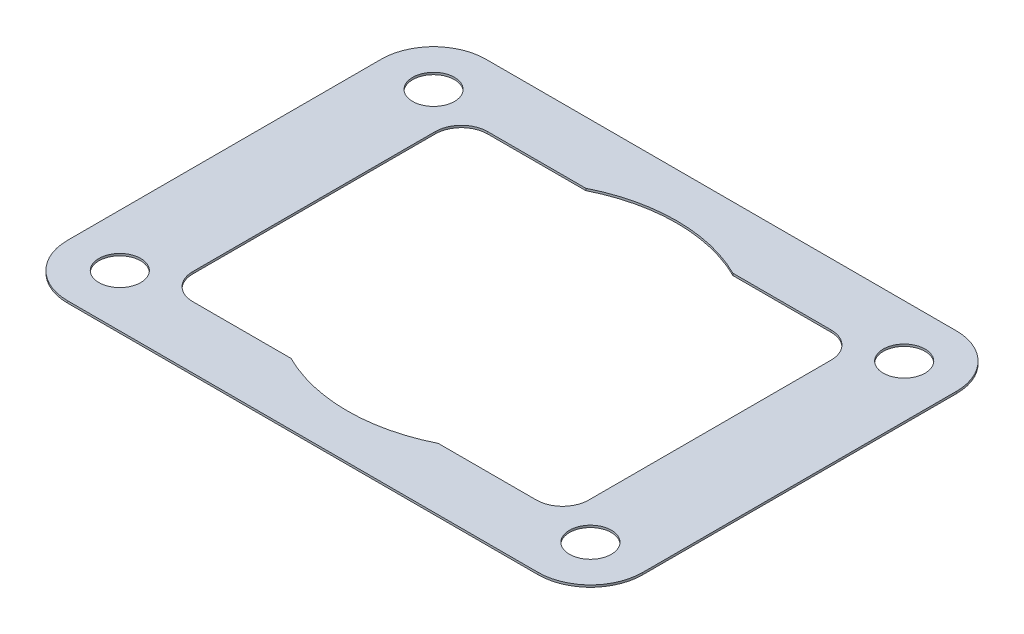
ISO-10303-21;
HEADER;
FILE_DESCRIPTION(('STEP AP214'),'2;1');
FILE_NAME('part.step','',(''),(''),'','','');
FILE_SCHEMA(('AUTOMOTIVE_DESIGN { 1 0 10303 214 1 1 1 1 }'));
ENDSEC;
DATA;
#1=APPLICATION_CONTEXT('core data for automotive mechanical design processes');
#2=APPLICATION_PROTOCOL_DEFINITION('international standard','automotive_design',2000,#1);
#3=PRODUCT_CONTEXT('',#1,'mechanical');
#4=PRODUCT('Part','Part','',(#3));
#5=PRODUCT_RELATED_PRODUCT_CATEGORY('part','',(#4));
#6=PRODUCT_DEFINITION_FORMATION('','',#4);
#7=PRODUCT_DEFINITION_CONTEXT('part definition',#1,'design');
#8=PRODUCT_DEFINITION('design','',#6,#7);
#9=PRODUCT_DEFINITION_SHAPE('','',#8);
#10=(LENGTH_UNIT() NAMED_UNIT(*) SI_UNIT(.MILLI.,.METRE.));
#11=(NAMED_UNIT(*) PLANE_ANGLE_UNIT() SI_UNIT($,.RADIAN.));
#12=(NAMED_UNIT(*) SI_UNIT($,.STERADIAN.) SOLID_ANGLE_UNIT());
#13=UNCERTAINTY_MEASURE_WITH_UNIT(LENGTH_MEASURE(1.E-05),#10,'distance_accuracy_value','');
#14=(GEOMETRIC_REPRESENTATION_CONTEXT(3) GLOBAL_UNCERTAINTY_ASSIGNED_CONTEXT((#13)) GLOBAL_UNIT_ASSIGNED_CONTEXT((#10,
#11,#12)) REPRESENTATION_CONTEXT('',''));
#15=CARTESIAN_POINT('',(0.,0.,0.));
#16=DIRECTION('',(0.,0.,1.));
#17=DIRECTION('',(1.,0.,0.));
#18=AXIS2_PLACEMENT_3D('',#15,#16,#17);
#19=CARTESIAN_POINT('',(48.0695,0.,-35.7886));
#20=DIRECTION('',(0.,0.,-1.));
#21=DIRECTION('',(-1.,0.,0.));
#22=AXIS2_PLACEMENT_3D('',#19,#20,#21);
#23=PLANE('',#22);
#24=DIRECTION('',(-1.,0.,0.));
#25=VECTOR('',#24,1.);
#26=CARTESIAN_POINT('',(48.0695,0.,-35.7886));
#27=LINE('',#26,#25);
#28=CARTESIAN_POINT('',(-17.8766925084032,0.,-35.7886));
#29=VERTEX_POINT('',#28);
#30=CARTESIAN_POINT('',(-41.7195,0.,-35.7886));
#31=VERTEX_POINT('',#30);
#32=EDGE_CURVE('E321',#29,#31,#27,.T.);
#33=ORIENTED_EDGE('',*,*,#32,.F.);
#34=DIRECTION('',(0.,1.,0.));
#35=VECTOR('',#34,1.);
#36=CARTESIAN_POINT('',(-17.8766925084032,0.,-35.7886));
#37=LINE('',#36,#35);
#38=CARTESIAN_POINT('',(-17.8766925084032,0.508,-35.7886));
#39=VERTEX_POINT('',#38);
#40=EDGE_CURVE('E378',#29,#39,#37,.T.);
#41=ORIENTED_EDGE('',*,*,#40,.T.);
#42=DIRECTION('',(-1.,0.,0.));
#43=VECTOR('',#42,1.);
#44=CARTESIAN_POINT('',(48.0695,0.508,-35.7886));
#45=LINE('',#44,#43);
#46=CARTESIAN_POINT('',(-41.7195,0.508,-35.7886));
#47=VERTEX_POINT('',#46);
#48=EDGE_CURVE('E204',#39,#47,#45,.T.);
#49=ORIENTED_EDGE('',*,*,#48,.T.);
#50=DIRECTION('',(0.,1.,0.));
#51=VECTOR('',#50,1.);
#52=CARTESIAN_POINT('',(-41.7195,0.,-35.7886));
#53=LINE('',#52,#51);
#54=EDGE_CURVE('E285',#47,#31,#53,.F.);
#55=ORIENTED_EDGE('',*,*,#54,.T.);
#56=EDGE_LOOP('',(#33,#41,#49,#55));
#57=FACE_BOUND('',#56,.T.);
#58=ADVANCED_FACE('F37',(#57),#23,.F.);
#59=CARTESIAN_POINT('',(48.0695,0.,35.7886));
#60=DIRECTION('',(0.,0.,1.));
#61=DIRECTION('',(1.,0.,0.));
#62=AXIS2_PLACEMENT_3D('',#59,#60,#61);
#63=PLANE('',#62);
#64=DIRECTION('',(1.,0.,0.));
#65=VECTOR('',#64,1.);
#66=CARTESIAN_POINT('',(48.0695,0.,35.7886));
#67=LINE('',#66,#65);
#68=CARTESIAN_POINT('',(17.8766925084032,0.,35.7886));
#69=VERTEX_POINT('',#68);
#70=CARTESIAN_POINT('',(41.7195,0.,35.7886));
#71=VERTEX_POINT('',#70);
#72=EDGE_CURVE('E186',#69,#71,#67,.T.);
#73=ORIENTED_EDGE('',*,*,#72,.F.);
#74=DIRECTION('',(0.,1.,0.));
#75=VECTOR('',#74,1.);
#76=CARTESIAN_POINT('',(17.8766925084032,0.,35.7886));
#77=LINE('',#76,#75);
#78=CARTESIAN_POINT('',(17.8766925084032,0.508,35.7886));
#79=VERTEX_POINT('',#78);
#80=EDGE_CURVE('E11',#69,#79,#77,.T.);
#81=ORIENTED_EDGE('',*,*,#80,.T.);
#82=DIRECTION('',(1.,0.,0.));
#83=VECTOR('',#82,1.);
#84=CARTESIAN_POINT('',(48.0695,0.508,35.7886));
#85=LINE('',#84,#83);
#86=CARTESIAN_POINT('',(41.7195,0.508,35.7886));
#87=VERTEX_POINT('',#86);
#88=EDGE_CURVE('E184',#79,#87,#85,.T.);
#89=ORIENTED_EDGE('',*,*,#88,.T.);
#90=DIRECTION('',(0.,1.,0.));
#91=VECTOR('',#90,1.);
#92=CARTESIAN_POINT('',(41.7195,0.,35.7886));
#93=LINE('',#92,#91);
#94=EDGE_CURVE('E278',#87,#71,#93,.F.);
#95=ORIENTED_EDGE('',*,*,#94,.T.);
#96=EDGE_LOOP('',(#73,#81,#89,#95));
#97=FACE_BOUND('',#96,.T.);
#98=ADVANCED_FACE('F182',(#97),#63,.F.);
#99=CARTESIAN_POINT('',(-69.85,0.508,50.8));
#100=DIRECTION('',(1.,0.,0.));
#101=DIRECTION('',(0.,0.,-1.));
#102=AXIS2_PLACEMENT_3D('',#99,#100,#101);
#103=PLANE('',#102);
#104=DIRECTION('',(0.,0.,1.));
#105=VECTOR('',#104,1.);
#106=CARTESIAN_POINT('',(-69.85,0.508,50.8));
#107=LINE('',#106,#105);
#108=CARTESIAN_POINT('',(-69.85,0.508,-38.1));
#109=VERTEX_POINT('',#108);
#110=CARTESIAN_POINT('',(-69.85,0.508,38.1));
#111=VERTEX_POINT('',#110);
#112=EDGE_CURVE('E209',#109,#111,#107,.T.);
#113=ORIENTED_EDGE('',*,*,#112,.F.);
#114=DIRECTION('',(0.,-1.,0.));
#115=VECTOR('',#114,1.);
#116=CARTESIAN_POINT('',(-69.85,0.508,-38.1));
#117=LINE('',#116,#115);
#118=CARTESIAN_POINT('',(-69.85,0.,-38.1));
#119=VERTEX_POINT('',#118);
#120=EDGE_CURVE('E236',#109,#119,#117,.T.);
#121=ORIENTED_EDGE('',*,*,#120,.T.);
#122=DIRECTION('',(0.,0.,1.));
#123=VECTOR('',#122,1.);
#124=CARTESIAN_POINT('',(-69.85,0.,50.8));
#125=LINE('',#124,#123);
#126=CARTESIAN_POINT('',(-69.85,0.,38.1));
#127=VERTEX_POINT('',#126);
#128=EDGE_CURVE('E223',#119,#127,#125,.T.);
#129=ORIENTED_EDGE('',*,*,#128,.T.);
#130=DIRECTION('',(0.,-1.,0.));
#131=VECTOR('',#130,1.);
#132=CARTESIAN_POINT('',(-69.85,0.508,38.1));
#133=LINE('',#132,#131);
#134=EDGE_CURVE('E222',#127,#111,#133,.F.);
#135=ORIENTED_EDGE('',*,*,#134,.T.);
#136=EDGE_LOOP('',(#113,#121,#129,#135));
#137=FACE_BOUND('',#136,.T.);
#138=ADVANCED_FACE('F358',(#137),#103,.F.);
#139=CARTESIAN_POINT('',(69.85,0.508,50.8));
#140=DIRECTION('',(0.,0.,-1.));
#141=DIRECTION('',(-1.,0.,0.));
#142=AXIS2_PLACEMENT_3D('',#139,#140,#141);
#143=PLANE('',#142);
#144=DIRECTION('',(1.,0.,0.));
#145=VECTOR('',#144,1.);
#146=CARTESIAN_POINT('',(69.85,0.,50.8));
#147=LINE('',#146,#145);
#148=CARTESIAN_POINT('',(-57.15,0.,50.8));
#149=VERTEX_POINT('',#148);
#150=CARTESIAN_POINT('',(57.15,0.,50.8));
#151=VERTEX_POINT('',#150);
#152=EDGE_CURVE('E226',#149,#151,#147,.T.);
#153=ORIENTED_EDGE('',*,*,#152,.T.);
#154=DIRECTION('',(0.,-1.,0.));
#155=VECTOR('',#154,1.);
#156=CARTESIAN_POINT('',(57.15,0.508,50.8));
#157=LINE('',#156,#155);
#158=CARTESIAN_POINT('',(57.15,0.508,50.8));
#159=VERTEX_POINT('',#158);
#160=EDGE_CURVE('E268',#151,#159,#157,.F.);
#161=ORIENTED_EDGE('',*,*,#160,.T.);
#162=DIRECTION('',(1.,0.,0.));
#163=VECTOR('',#162,1.);
#164=CARTESIAN_POINT('',(69.85,0.508,50.8));
#165=LINE('',#164,#163);
#166=CARTESIAN_POINT('',(-57.15,0.508,50.8));
#167=VERTEX_POINT('',#166);
#168=EDGE_CURVE('E212',#167,#159,#165,.T.);
#169=ORIENTED_EDGE('',*,*,#168,.F.);
#170=DIRECTION('',(0.,-1.,0.));
#171=VECTOR('',#170,1.);
#172=CARTESIAN_POINT('',(-57.15,0.508,50.8));
#173=LINE('',#172,#171);
#174=EDGE_CURVE('E265',#167,#149,#173,.T.);
#175=ORIENTED_EDGE('',*,*,#174,.T.);
#176=EDGE_LOOP('',(#153,#161,#169,#175));
#177=FACE_BOUND('',#176,.T.);
#178=ADVANCED_FACE('F429',(#177),#143,.F.);
#179=CARTESIAN_POINT('',(69.85,0.508,50.8));
#180=DIRECTION('',(-1.,0.,0.));
#181=DIRECTION('',(0.,0.,1.));
#182=AXIS2_PLACEMENT_3D('',#179,#180,#181);
#183=PLANE('',#182);
#184=DIRECTION('',(0.,0.,-1.));
#185=VECTOR('',#184,1.);
#186=CARTESIAN_POINT('',(69.85,0.,50.8));
#187=LINE('',#186,#185);
#188=CARTESIAN_POINT('',(69.85,0.,38.1));
#189=VERTEX_POINT('',#188);
#190=CARTESIAN_POINT('',(69.85,0.,-38.1));
#191=VERTEX_POINT('',#190);
#192=EDGE_CURVE('E230',#189,#191,#187,.T.);
#193=ORIENTED_EDGE('',*,*,#192,.T.);
#194=DIRECTION('',(0.,-1.,0.));
#195=VECTOR('',#194,1.);
#196=CARTESIAN_POINT('',(69.85,0.508,-38.1));
#197=LINE('',#196,#195);
#198=CARTESIAN_POINT('',(69.85,0.508,-38.1));
#199=VERTEX_POINT('',#198);
#200=EDGE_CURVE('E263',#191,#199,#197,.F.);
#201=ORIENTED_EDGE('',*,*,#200,.T.);
#202=DIRECTION('',(0.,0.,-1.));
#203=VECTOR('',#202,1.);
#204=CARTESIAN_POINT('',(69.85,0.508,50.8));
#205=LINE('',#204,#203);
#206=CARTESIAN_POINT('',(69.85,0.508,38.1));
#207=VERTEX_POINT('',#206);
#208=EDGE_CURVE('E216',#207,#199,#205,.T.);
#209=ORIENTED_EDGE('',*,*,#208,.F.);
#210=DIRECTION('',(0.,-1.,0.));
#211=VECTOR('',#210,1.);
#212=CARTESIAN_POINT('',(69.85,0.508,38.1));
#213=LINE('',#212,#211);
#214=EDGE_CURVE('E260',#207,#189,#213,.T.);
#215=ORIENTED_EDGE('',*,*,#214,.T.);
#216=EDGE_LOOP('',(#193,#201,#209,#215));
#217=FACE_BOUND('',#216,.T.);
#218=ADVANCED_FACE('F438',(#217),#183,.F.);
#219=CARTESIAN_POINT('',(69.85,0.508,-50.8));
#220=DIRECTION('',(0.,0.,1.));
#221=DIRECTION('',(1.,0.,0.));
#222=AXIS2_PLACEMENT_3D('',#219,#220,#221);
#223=PLANE('',#222);
#224=DIRECTION('',(-1.,0.,0.));
#225=VECTOR('',#224,1.);
#226=CARTESIAN_POINT('',(69.85,0.,-50.8));
#227=LINE('',#226,#225);
#228=CARTESIAN_POINT('',(57.15,0.,-50.8));
#229=VERTEX_POINT('',#228);
#230=CARTESIAN_POINT('',(-57.15,0.,-50.8));
#231=VERTEX_POINT('',#230);
#232=EDGE_CURVE('E213',#229,#231,#227,.T.);
#233=ORIENTED_EDGE('',*,*,#232,.T.);
#234=DIRECTION('',(0.,-1.,0.));
#235=VECTOR('',#234,1.);
#236=CARTESIAN_POINT('',(-57.15,0.508,-50.8));
#237=LINE('',#236,#235);
#238=CARTESIAN_POINT('',(-57.15,0.508,-50.8));
#239=VERTEX_POINT('',#238);
#240=EDGE_CURVE('E250',#231,#239,#237,.F.);
#241=ORIENTED_EDGE('',*,*,#240,.T.);
#242=DIRECTION('',(-1.,0.,0.));
#243=VECTOR('',#242,1.);
#244=CARTESIAN_POINT('',(69.85,0.508,-50.8));
#245=LINE('',#244,#243);
#246=CARTESIAN_POINT('',(57.15,0.508,-50.8));
#247=VERTEX_POINT('',#246);
#248=EDGE_CURVE('E219',#247,#239,#245,.T.);
#249=ORIENTED_EDGE('',*,*,#248,.F.);
#250=DIRECTION('',(0.,-1.,0.));
#251=VECTOR('',#250,1.);
#252=CARTESIAN_POINT('',(57.15,0.508,-50.8));
#253=LINE('',#252,#251);
#254=EDGE_CURVE('E247',#247,#229,#253,.T.);
#255=ORIENTED_EDGE('',*,*,#254,.T.);
#256=EDGE_LOOP('',(#233,#241,#249,#255));
#257=FACE_BOUND('',#256,.T.);
#258=ADVANCED_FACE('F407',(#257),#223,.F.);
#259=CARTESIAN_POINT('',(0.,0.508,0.));
#260=DIRECTION('',(0.,1.,0.));
#261=DIRECTION('',(0.,0.,1.));
#262=AXIS2_PLACEMENT_3D('',#259,#260,#261);
#263=PLANE('',#262);
#264=CARTESIAN_POINT('',(0.,0.508,0.));
#265=DIRECTION('',(0.,1.,0.));
#266=DIRECTION('',(0.,0.,1.));
#267=AXIS2_PLACEMENT_3D('',#264,#265,#266);
#268=CIRCLE('',#267,40.005);
#269=CARTESIAN_POINT('',(17.8766925084032,0.508,-35.7886));
#270=VERTEX_POINT('',#269);
#271=EDGE_CURVE('E178',#270,#39,#268,.T.);
#272=ORIENTED_EDGE('',*,*,#271,.F.);
#273=CARTESIAN_POINT('',(41.7195,0.508,-35.7886));
#274=VERTEX_POINT('',#273);
#275=EDGE_CURVE('E205',#274,#270,#45,.T.);
#276=ORIENTED_EDGE('',*,*,#275,.F.);
#277=CARTESIAN_POINT('',(41.7195,0.508,-29.4386));
#278=DIRECTION('',(0.,1.,0.));
#279=DIRECTION('',(0.,0.,1.));
#280=AXIS2_PLACEMENT_3D('',#277,#278,#279);
#281=CIRCLE('',#280,6.35);
#282=CARTESIAN_POINT('',(48.0695,0.508,-29.4386));
#283=VERTEX_POINT('',#282);
#284=EDGE_CURVE('E298',#274,#283,#281,.F.);
#285=ORIENTED_EDGE('',*,*,#284,.T.);
#286=DIRECTION('',(0.,0.,-1.));
#287=VECTOR('',#286,1.);
#288=CARTESIAN_POINT('',(48.0695,0.508,35.7886));
#289=LINE('',#288,#287);
#290=CARTESIAN_POINT('',(48.0695,0.508,29.4386));
#291=VERTEX_POINT('',#290);
#292=EDGE_CURVE('E196',#291,#283,#289,.T.);
#293=ORIENTED_EDGE('',*,*,#292,.F.);
#294=CARTESIAN_POINT('',(41.7195,0.508,29.4386));
#295=DIRECTION('',(0.,1.,0.));
#296=DIRECTION('',(0.,0.,1.));
#297=AXIS2_PLACEMENT_3D('',#294,#295,#296);
#298=CIRCLE('',#297,6.35);
#299=EDGE_CURVE('E191',#291,#87,#298,.F.);
#300=ORIENTED_EDGE('',*,*,#299,.T.);
#301=ORIENTED_EDGE('',*,*,#88,.F.);
#302=CARTESIAN_POINT('',(-17.8766925084032,0.508,35.7886));
#303=VERTEX_POINT('',#302);
#304=EDGE_CURVE('E172',#303,#79,#268,.T.);
#305=ORIENTED_EDGE('',*,*,#304,.F.);
#306=CARTESIAN_POINT('',(-41.7195,0.508,35.7886));
#307=VERTEX_POINT('',#306);
#308=EDGE_CURVE('E193',#307,#303,#85,.T.);
#309=ORIENTED_EDGE('',*,*,#308,.F.);
#310=CARTESIAN_POINT('',(-41.7195,0.508,29.4386));
#311=DIRECTION('',(0.,1.,0.));
#312=DIRECTION('',(0.,0.,1.));
#313=AXIS2_PLACEMENT_3D('',#310,#311,#312);
#314=CIRCLE('',#313,6.35);
#315=CARTESIAN_POINT('',(-48.0695,0.508,29.4386));
#316=VERTEX_POINT('',#315);
#317=EDGE_CURVE('E294',#307,#316,#314,.F.);
#318=ORIENTED_EDGE('',*,*,#317,.T.);
#319=DIRECTION('',(0.,0.,1.));
#320=VECTOR('',#319,1.);
#321=CARTESIAN_POINT('',(-48.0695,0.508,35.7886));
#322=LINE('',#321,#320);
#323=CARTESIAN_POINT('',(-48.0695,0.508,-29.4386));
#324=VERTEX_POINT('',#323);
#325=EDGE_CURVE('E194',#324,#316,#322,.T.);
#326=ORIENTED_EDGE('',*,*,#325,.F.);
#327=CARTESIAN_POINT('',(-41.7195,0.508,-29.4386));
#328=DIRECTION('',(0.,1.,0.));
#329=DIRECTION('',(0.,0.,1.));
#330=AXIS2_PLACEMENT_3D('',#327,#328,#329);
#331=CIRCLE('',#330,6.35);
#332=EDGE_CURVE('E302',#324,#47,#331,.F.);
#333=ORIENTED_EDGE('',*,*,#332,.T.);
#334=ORIENTED_EDGE('',*,*,#48,.F.);
#335=EDGE_LOOP('',(#272,#276,#285,#293,#300,#301,#305,#309,#318,#326,#333,#334));
#336=FACE_BOUND('',#335,.T.);
#337=CARTESIAN_POINT('',(57.15,0.508,38.1));
#338=DIRECTION('',(0.,1.,0.));
#339=DIRECTION('',(0.,0.,-1.));
#340=AXIS2_PLACEMENT_3D('',#337,#338,#339);
#341=CIRCLE('',#340,5.08000000000001);
#342=CARTESIAN_POINT('',(57.15,0.508,33.02));
#343=VERTEX_POINT('',#342);
#344=EDGE_CURVE('E380',#343,#343,#341,.T.);
#345=ORIENTED_EDGE('',*,*,#344,.F.);
#346=EDGE_LOOP('',(#345));
#347=FACE_BOUND('',#346,.T.);
#348=CARTESIAN_POINT('',(-57.15,0.508,38.1));
#349=DIRECTION('',(0.,-1.,0.));
#350=DIRECTION('',(0.,0.,-1.));
#351=AXIS2_PLACEMENT_3D('',#348,#349,#350);
#352=CIRCLE('',#351,5.08000000000001);
#353=CARTESIAN_POINT('',(-57.15,0.508,33.02));
#354=VERTEX_POINT('',#353);
#355=EDGE_CURVE('E384',#354,#354,#352,.T.);
#356=ORIENTED_EDGE('',*,*,#355,.T.);
#357=EDGE_LOOP('',(#356));
#358=FACE_BOUND('',#357,.T.);
#359=CARTESIAN_POINT('',(57.15,0.508,-38.1));
#360=DIRECTION('',(0.,-1.,0.));
#361=DIRECTION('',(0.,0.,1.));
#362=AXIS2_PLACEMENT_3D('',#359,#360,#361);
#363=CIRCLE('',#362,5.08000000000001);
#364=CARTESIAN_POINT('',(57.15,0.508,-33.02));
#365=VERTEX_POINT('',#364);
#366=EDGE_CURVE('E390',#365,#365,#363,.T.);
#367=ORIENTED_EDGE('',*,*,#366,.T.);
#368=EDGE_LOOP('',(#367));
#369=FACE_BOUND('',#368,.T.);
#370=CARTESIAN_POINT('',(-57.15,0.508,-38.1));
#371=DIRECTION('',(0.,1.,0.));
#372=DIRECTION('',(0.,0.,1.));
#373=AXIS2_PLACEMENT_3D('',#370,#371,#372);
#374=CIRCLE('',#373,5.08000000000001);
#375=CARTESIAN_POINT('',(-57.15,0.508,-33.02));
#376=VERTEX_POINT('',#375);
#377=EDGE_CURVE('E396',#376,#376,#374,.T.);
#378=ORIENTED_EDGE('',*,*,#377,.F.);
#379=EDGE_LOOP('',(#378));
#380=FACE_BOUND('',#379,.T.);
#381=ORIENTED_EDGE('',*,*,#248,.T.);
#382=CARTESIAN_POINT('',(-57.15,0.508,-38.1));
#383=DIRECTION('',(0.,1.,0.));
#384=DIRECTION('',(0.,0.,1.));
#385=AXIS2_PLACEMENT_3D('',#382,#383,#384);
#386=CIRCLE('',#385,12.7);
#387=EDGE_CURVE('E258',#239,#109,#386,.T.);
#388=ORIENTED_EDGE('',*,*,#387,.T.);
#389=ORIENTED_EDGE('',*,*,#112,.T.);
#390=CARTESIAN_POINT('',(-57.15,0.508,38.1));
#391=DIRECTION('',(0.,1.,0.));
#392=DIRECTION('',(0.,0.,1.));
#393=AXIS2_PLACEMENT_3D('',#390,#391,#392);
#394=CIRCLE('',#393,12.7);
#395=EDGE_CURVE('E252',#111,#167,#394,.T.);
#396=ORIENTED_EDGE('',*,*,#395,.T.);
#397=ORIENTED_EDGE('',*,*,#168,.T.);
#398=CARTESIAN_POINT('',(57.15,0.508,38.1));
#399=DIRECTION('',(0.,1.,0.));
#400=DIRECTION('',(0.,0.,1.));
#401=AXIS2_PLACEMENT_3D('',#398,#399,#400);
#402=CIRCLE('',#401,12.7);
#403=EDGE_CURVE('E254',#159,#207,#402,.T.);
#404=ORIENTED_EDGE('',*,*,#403,.T.);
#405=ORIENTED_EDGE('',*,*,#208,.T.);
#406=CARTESIAN_POINT('',(57.15,0.508,-38.1));
#407=DIRECTION('',(0.,1.,0.));
#408=DIRECTION('',(0.,0.,1.));
#409=AXIS2_PLACEMENT_3D('',#406,#407,#408);
#410=CIRCLE('',#409,12.7);
#411=EDGE_CURVE('E256',#199,#247,#410,.T.);
#412=ORIENTED_EDGE('',*,*,#411,.T.);
#413=EDGE_LOOP('',(#381,#388,#389,#396,#397,#404,#405,#412));
#414=FACE_BOUND('',#413,.T.);
#415=ADVANCED_FACE('F188',(#336,#347,#358,#369,#380,#414),#263,.T.);
#416=CARTESIAN_POINT('',(0.,0.,0.));
#417=DIRECTION('',(0.,1.,0.));
#418=DIRECTION('',(0.,0.,1.));
#419=AXIS2_PLACEMENT_3D('',#416,#417,#418);
#420=PLANE('',#419);
#421=CARTESIAN_POINT('',(57.15,0.,38.1));
#422=DIRECTION('',(0.,1.,0.));
#423=DIRECTION('',(0.,0.,-1.));
#424=AXIS2_PLACEMENT_3D('',#421,#422,#423);
#425=CIRCLE('',#424,5.08000000000001);
#426=CARTESIAN_POINT('',(57.15,0.,33.02));
#427=VERTEX_POINT('',#426);
#428=EDGE_CURVE('E381',#427,#427,#425,.T.);
#429=ORIENTED_EDGE('',*,*,#428,.T.);
#430=EDGE_LOOP('',(#429));
#431=FACE_BOUND('',#430,.T.);
#432=CARTESIAN_POINT('',(-57.15,0.,38.1));
#433=DIRECTION('',(0.,-1.,0.));
#434=DIRECTION('',(0.,0.,-1.));
#435=AXIS2_PLACEMENT_3D('',#432,#433,#434);
#436=CIRCLE('',#435,5.08000000000001);
#437=CARTESIAN_POINT('',(-57.15,0.,33.02));
#438=VERTEX_POINT('',#437);
#439=EDGE_CURVE('E387',#438,#438,#436,.T.);
#440=ORIENTED_EDGE('',*,*,#439,.F.);
#441=EDGE_LOOP('',(#440));
#442=FACE_BOUND('',#441,.T.);
#443=CARTESIAN_POINT('',(57.15,0.,-38.1));
#444=DIRECTION('',(0.,-1.,0.));
#445=DIRECTION('',(0.,0.,1.));
#446=AXIS2_PLACEMENT_3D('',#443,#444,#445);
#447=CIRCLE('',#446,5.08000000000001);
#448=CARTESIAN_POINT('',(57.15,0.,-33.02));
#449=VERTEX_POINT('',#448);
#450=EDGE_CURVE('E393',#449,#449,#447,.T.);
#451=ORIENTED_EDGE('',*,*,#450,.F.);
#452=EDGE_LOOP('',(#451));
#453=FACE_BOUND('',#452,.T.);
#454=CARTESIAN_POINT('',(-57.15,0.,-38.1));
#455=DIRECTION('',(0.,1.,0.));
#456=DIRECTION('',(0.,0.,1.));
#457=AXIS2_PLACEMENT_3D('',#454,#455,#456);
#458=CIRCLE('',#457,5.08000000000001);
#459=CARTESIAN_POINT('',(-57.15,0.,-33.02));
#460=VERTEX_POINT('',#459);
#461=EDGE_CURVE('E198',#460,#460,#458,.T.);
#462=ORIENTED_EDGE('',*,*,#461,.T.);
#463=EDGE_LOOP('',(#462));
#464=FACE_BOUND('',#463,.T.);
#465=CARTESIAN_POINT('',(41.7195,0.,-35.7886));
#466=VERTEX_POINT('',#465);
#467=CARTESIAN_POINT('',(17.8766925084032,0.,-35.7886));
#468=VERTEX_POINT('',#467);
#469=EDGE_CURVE('E227',#466,#468,#27,.T.);
#470=ORIENTED_EDGE('',*,*,#469,.T.);
#471=CARTESIAN_POINT('',(0.,0.,0.));
#472=DIRECTION('',(0.,1.,0.));
#473=DIRECTION('',(0.,0.,1.));
#474=AXIS2_PLACEMENT_3D('',#471,#472,#473);
#475=CIRCLE('',#474,40.005);
#476=EDGE_CURVE('E52',#468,#29,#475,.T.);
#477=ORIENTED_EDGE('',*,*,#476,.T.);
#478=ORIENTED_EDGE('',*,*,#32,.T.);
#479=CARTESIAN_POINT('',(-41.7195,0.,-29.4386));
#480=DIRECTION('',(0.,1.,0.));
#481=DIRECTION('',(0.,0.,1.));
#482=AXIS2_PLACEMENT_3D('',#479,#480,#481);
#483=CIRCLE('',#482,6.35);
#484=CARTESIAN_POINT('',(-48.0695,0.,-29.4386));
#485=VERTEX_POINT('',#484);
#486=EDGE_CURVE('E305',#31,#485,#483,.T.);
#487=ORIENTED_EDGE('',*,*,#486,.T.);
#488=DIRECTION('',(0.,0.,1.));
#489=VECTOR('',#488,1.);
#490=CARTESIAN_POINT('',(-48.0695,0.,35.7886));
#491=LINE('',#490,#489);
#492=CARTESIAN_POINT('',(-48.0695,0.,29.4386));
#493=VERTEX_POINT('',#492);
#494=EDGE_CURVE('E208',#485,#493,#491,.T.);
#495=ORIENTED_EDGE('',*,*,#494,.T.);
#496=CARTESIAN_POINT('',(-41.7195,0.,29.4386));
#497=DIRECTION('',(0.,1.,0.));
#498=DIRECTION('',(0.,0.,1.));
#499=AXIS2_PLACEMENT_3D('',#496,#497,#498);
#500=CIRCLE('',#499,6.35);
#501=CARTESIAN_POINT('',(-41.7195,0.,35.7886));
#502=VERTEX_POINT('',#501);
#503=EDGE_CURVE('E296',#493,#502,#500,.T.);
#504=ORIENTED_EDGE('',*,*,#503,.T.);
#505=CARTESIAN_POINT('',(-17.8766925084032,0.,35.7886));
#506=VERTEX_POINT('',#505);
#507=EDGE_CURVE('E310',#502,#506,#67,.T.);
#508=ORIENTED_EDGE('',*,*,#507,.T.);
#509=EDGE_CURVE('E60',#506,#69,#475,.T.);
#510=ORIENTED_EDGE('',*,*,#509,.T.);
#511=ORIENTED_EDGE('',*,*,#72,.T.);
#512=CARTESIAN_POINT('',(41.7195,0.,29.4386));
#513=DIRECTION('',(0.,1.,0.));
#514=DIRECTION('',(0.,0.,1.));
#515=AXIS2_PLACEMENT_3D('',#512,#513,#514);
#516=CIRCLE('',#515,6.35);
#517=CARTESIAN_POINT('',(48.0695,0.,29.4386));
#518=VERTEX_POINT('',#517);
#519=EDGE_CURVE('E292',#71,#518,#516,.T.);
#520=ORIENTED_EDGE('',*,*,#519,.T.);
#521=DIRECTION('',(0.,0.,-1.));
#522=VECTOR('',#521,1.);
#523=CARTESIAN_POINT('',(48.0695,0.,35.7886));
#524=LINE('',#523,#522);
#525=CARTESIAN_POINT('',(48.0695,0.,-29.4386));
#526=VERTEX_POINT('',#525);
#527=EDGE_CURVE('E318',#518,#526,#524,.T.);
#528=ORIENTED_EDGE('',*,*,#527,.T.);
#529=CARTESIAN_POINT('',(41.7195,0.,-29.4386));
#530=DIRECTION('',(0.,1.,0.));
#531=DIRECTION('',(0.,0.,1.));
#532=AXIS2_PLACEMENT_3D('',#529,#530,#531);
#533=CIRCLE('',#532,6.35);
#534=EDGE_CURVE('E300',#526,#466,#533,.T.);
#535=ORIENTED_EDGE('',*,*,#534,.T.);
#536=EDGE_LOOP('',(#470,#477,#478,#487,#495,#504,#508,#510,#511,#520,#528,#535));
#537=FACE_BOUND('',#536,.T.);
#538=ORIENTED_EDGE('',*,*,#128,.F.);
#539=CARTESIAN_POINT('',(-57.15,0.,-38.1));
#540=DIRECTION('',(0.,1.,0.));
#541=DIRECTION('',(0.,0.,1.));
#542=AXIS2_PLACEMENT_3D('',#539,#540,#541);
#543=CIRCLE('',#542,12.7);
#544=EDGE_CURVE('E245',#119,#231,#543,.F.);
#545=ORIENTED_EDGE('',*,*,#544,.T.);
#546=ORIENTED_EDGE('',*,*,#232,.F.);
#547=CARTESIAN_POINT('',(57.15,0.,-38.1));
#548=DIRECTION('',(0.,1.,0.));
#549=DIRECTION('',(0.,0.,1.));
#550=AXIS2_PLACEMENT_3D('',#547,#548,#549);
#551=CIRCLE('',#550,12.7);
#552=EDGE_CURVE('E243',#229,#191,#551,.F.);
#553=ORIENTED_EDGE('',*,*,#552,.T.);
#554=ORIENTED_EDGE('',*,*,#192,.F.);
#555=CARTESIAN_POINT('',(57.15,0.,38.1));
#556=DIRECTION('',(0.,1.,0.));
#557=DIRECTION('',(0.,0.,1.));
#558=AXIS2_PLACEMENT_3D('',#555,#556,#557);
#559=CIRCLE('',#558,12.7);
#560=EDGE_CURVE('E241',#189,#151,#559,.F.);
#561=ORIENTED_EDGE('',*,*,#560,.T.);
#562=ORIENTED_EDGE('',*,*,#152,.F.);
#563=CARTESIAN_POINT('',(-57.15,0.,38.1));
#564=DIRECTION('',(0.,1.,0.));
#565=DIRECTION('',(0.,0.,1.));
#566=AXIS2_PLACEMENT_3D('',#563,#564,#565);
#567=CIRCLE('',#566,12.7);
#568=EDGE_CURVE('E239',#149,#127,#567,.F.);
#569=ORIENTED_EDGE('',*,*,#568,.T.);
#570=EDGE_LOOP('',(#538,#545,#546,#553,#554,#561,#562,#569));
#571=FACE_BOUND('',#570,.T.);
#572=ADVANCED_FACE('F314',(#431,#442,#453,#464,#537,#571),#420,.F.);
#573=CARTESIAN_POINT('',(-57.15,0.508,-38.1));
#574=DIRECTION('',(0.,-1.,0.));
#575=DIRECTION('',(0.,0.,-1.));
#576=AXIS2_PLACEMENT_3D('',#573,#574,#575);
#577=CYLINDRICAL_SURFACE('',#576,12.7);
#578=ORIENTED_EDGE('',*,*,#387,.F.);
#579=ORIENTED_EDGE('',*,*,#240,.F.);
#580=ORIENTED_EDGE('',*,*,#544,.F.);
#581=ORIENTED_EDGE('',*,*,#120,.F.);
#582=EDGE_LOOP('',(#578,#579,#580,#581));
#583=FACE_BOUND('',#582,.T.);
#584=ADVANCED_FACE('F418',(#583),#577,.T.);
#585=CARTESIAN_POINT('',(57.15,0.508,-38.1));
#586=DIRECTION('',(0.,-1.,0.));
#587=DIRECTION('',(0.,0.,-1.));
#588=AXIS2_PLACEMENT_3D('',#585,#586,#587);
#589=CYLINDRICAL_SURFACE('',#588,12.7);
#590=ORIENTED_EDGE('',*,*,#411,.F.);
#591=ORIENTED_EDGE('',*,*,#200,.F.);
#592=ORIENTED_EDGE('',*,*,#552,.F.);
#593=ORIENTED_EDGE('',*,*,#254,.F.);
#594=EDGE_LOOP('',(#590,#591,#592,#593));
#595=FACE_BOUND('',#594,.T.);
#596=ADVANCED_FACE('F441',(#595),#589,.T.);
#597=CARTESIAN_POINT('',(57.15,0.508,38.1));
#598=DIRECTION('',(0.,-1.,0.));
#599=DIRECTION('',(0.,0.,-1.));
#600=AXIS2_PLACEMENT_3D('',#597,#598,#599);
#601=CYLINDRICAL_SURFACE('',#600,12.7);
#602=ORIENTED_EDGE('',*,*,#403,.F.);
#603=ORIENTED_EDGE('',*,*,#160,.F.);
#604=ORIENTED_EDGE('',*,*,#560,.F.);
#605=ORIENTED_EDGE('',*,*,#214,.F.);
#606=EDGE_LOOP('',(#602,#603,#604,#605));
#607=FACE_BOUND('',#606,.T.);
#608=ADVANCED_FACE('F435',(#607),#601,.T.);
#609=CARTESIAN_POINT('',(-57.15,0.508,38.1));
#610=DIRECTION('',(0.,-1.,0.));
#611=DIRECTION('',(0.,0.,-1.));
#612=AXIS2_PLACEMENT_3D('',#609,#610,#611);
#613=CYLINDRICAL_SURFACE('',#612,12.7);
#614=ORIENTED_EDGE('',*,*,#395,.F.);
#615=ORIENTED_EDGE('',*,*,#134,.F.);
#616=ORIENTED_EDGE('',*,*,#568,.F.);
#617=ORIENTED_EDGE('',*,*,#174,.F.);
#618=EDGE_LOOP('',(#614,#615,#616,#617));
#619=FACE_BOUND('',#618,.T.);
#620=ADVANCED_FACE('F370',(#619),#613,.T.);
#621=CARTESIAN_POINT('',(-48.0695,0.,35.7886));
#622=DIRECTION('',(-1.,0.,0.));
#623=DIRECTION('',(0.,0.,1.));
#624=AXIS2_PLACEMENT_3D('',#621,#622,#623);
#625=PLANE('',#624);
#626=ORIENTED_EDGE('',*,*,#325,.T.);
#627=DIRECTION('',(0.,1.,0.));
#628=VECTOR('',#627,1.);
#629=CARTESIAN_POINT('',(-48.0695,0.,29.4386));
#630=LINE('',#629,#628);
#631=EDGE_CURVE('E283',#316,#493,#630,.F.);
#632=ORIENTED_EDGE('',*,*,#631,.T.);
#633=ORIENTED_EDGE('',*,*,#494,.F.);
#634=DIRECTION('',(0.,1.,0.));
#635=VECTOR('',#634,1.);
#636=CARTESIAN_POINT('',(-48.0695,0.508,-29.4386));
#637=LINE('',#636,#635);
#638=EDGE_CURVE('E280',#485,#324,#637,.T.);
#639=ORIENTED_EDGE('',*,*,#638,.T.);
#640=EDGE_LOOP('',(#626,#632,#633,#639));
#641=FACE_BOUND('',#640,.T.);
#642=ADVANCED_FACE('F337',(#641),#625,.F.);
#643=ORIENTED_EDGE('',*,*,#275,.T.);
#644=DIRECTION('',(0.,1.,0.));
#645=VECTOR('',#644,1.);
#646=CARTESIAN_POINT('',(17.8766925084032,0.,-35.7886));
#647=LINE('',#646,#645);
#648=EDGE_CURVE('E373',#270,#468,#647,.F.);
#649=ORIENTED_EDGE('',*,*,#648,.T.);
#650=ORIENTED_EDGE('',*,*,#469,.F.);
#651=DIRECTION('',(0.,1.,0.));
#652=VECTOR('',#651,1.);
#653=CARTESIAN_POINT('',(41.7195,0.508,-35.7886));
#654=LINE('',#653,#652);
#655=EDGE_CURVE('E288',#466,#274,#654,.T.);
#656=ORIENTED_EDGE('',*,*,#655,.T.);
#657=EDGE_LOOP('',(#643,#649,#650,#656));
#658=FACE_BOUND('',#657,.T.);
#659=ADVANCED_FACE('F354',(#658),#23,.F.);
#660=CARTESIAN_POINT('',(48.0695,0.,35.7886));
#661=DIRECTION('',(1.,0.,0.));
#662=DIRECTION('',(0.,0.,-1.));
#663=AXIS2_PLACEMENT_3D('',#660,#661,#662);
#664=PLANE('',#663);
#665=ORIENTED_EDGE('',*,*,#527,.F.);
#666=DIRECTION('',(0.,1.,0.));
#667=VECTOR('',#666,1.);
#668=CARTESIAN_POINT('',(48.0695,0.508,29.4386));
#669=LINE('',#668,#667);
#670=EDGE_CURVE('E272',#518,#291,#669,.T.);
#671=ORIENTED_EDGE('',*,*,#670,.T.);
#672=ORIENTED_EDGE('',*,*,#292,.T.);
#673=DIRECTION('',(0.,1.,0.));
#674=VECTOR('',#673,1.);
#675=CARTESIAN_POINT('',(48.0695,0.,-29.4386));
#676=LINE('',#675,#674);
#677=EDGE_CURVE('E270',#283,#526,#676,.F.);
#678=ORIENTED_EDGE('',*,*,#677,.T.);
#679=EDGE_LOOP('',(#665,#671,#672,#678));
#680=FACE_BOUND('',#679,.T.);
#681=ADVANCED_FACE('F363',(#680),#664,.F.);
#682=ORIENTED_EDGE('',*,*,#308,.T.);
#683=DIRECTION('',(0.,1.,0.));
#684=VECTOR('',#683,1.);
#685=CARTESIAN_POINT('',(-17.8766925084032,0.,35.7886));
#686=LINE('',#685,#684);
#687=EDGE_CURVE('E45',#303,#506,#686,.F.);
#688=ORIENTED_EDGE('',*,*,#687,.T.);
#689=ORIENTED_EDGE('',*,*,#507,.F.);
#690=DIRECTION('',(0.,1.,0.));
#691=VECTOR('',#690,1.);
#692=CARTESIAN_POINT('',(-41.7195,0.508,35.7886));
#693=LINE('',#692,#691);
#694=EDGE_CURVE('E275',#502,#307,#693,.T.);
#695=ORIENTED_EDGE('',*,*,#694,.T.);
#696=EDGE_LOOP('',(#682,#688,#689,#695));
#697=FACE_BOUND('',#696,.T.);
#698=ADVANCED_FACE('F309',(#697),#63,.F.);
#699=CARTESIAN_POINT('',(41.7195,0.,29.4386));
#700=DIRECTION('',(0.,-1.,0.));
#701=DIRECTION('',(0.,0.,-1.));
#702=AXIS2_PLACEMENT_3D('',#699,#700,#701);
#703=CYLINDRICAL_SURFACE('',#702,6.35);
#704=ORIENTED_EDGE('',*,*,#519,.F.);
#705=ORIENTED_EDGE('',*,*,#94,.F.);
#706=ORIENTED_EDGE('',*,*,#299,.F.);
#707=ORIENTED_EDGE('',*,*,#670,.F.);
#708=EDGE_LOOP('',(#704,#705,#706,#707));
#709=FACE_BOUND('',#708,.T.);
#710=ADVANCED_FACE('F343',(#709),#703,.F.);
#711=CARTESIAN_POINT('',(-41.7195,0.,29.4386));
#712=DIRECTION('',(0.,-1.,0.));
#713=DIRECTION('',(0.,0.,-1.));
#714=AXIS2_PLACEMENT_3D('',#711,#712,#713);
#715=CYLINDRICAL_SURFACE('',#714,6.35);
#716=ORIENTED_EDGE('',*,*,#503,.F.);
#717=ORIENTED_EDGE('',*,*,#631,.F.);
#718=ORIENTED_EDGE('',*,*,#317,.F.);
#719=ORIENTED_EDGE('',*,*,#694,.F.);
#720=EDGE_LOOP('',(#716,#717,#718,#719));
#721=FACE_BOUND('',#720,.T.);
#722=ADVANCED_FACE('F340',(#721),#715,.F.);
#723=CARTESIAN_POINT('',(41.7195,0.,-29.4386));
#724=DIRECTION('',(0.,-1.,0.));
#725=DIRECTION('',(0.,0.,-1.));
#726=AXIS2_PLACEMENT_3D('',#723,#724,#725);
#727=CYLINDRICAL_SURFACE('',#726,6.35);
#728=ORIENTED_EDGE('',*,*,#534,.F.);
#729=ORIENTED_EDGE('',*,*,#677,.F.);
#730=ORIENTED_EDGE('',*,*,#284,.F.);
#731=ORIENTED_EDGE('',*,*,#655,.F.);
#732=EDGE_LOOP('',(#728,#729,#730,#731));
#733=FACE_BOUND('',#732,.T.);
#734=ADVANCED_FACE('F342',(#733),#727,.F.);
#735=CARTESIAN_POINT('',(-41.7195,0.,-29.4386));
#736=DIRECTION('',(0.,-1.,0.));
#737=DIRECTION('',(0.,0.,-1.));
#738=AXIS2_PLACEMENT_3D('',#735,#736,#737);
#739=CYLINDRICAL_SURFACE('',#738,6.35);
#740=ORIENTED_EDGE('',*,*,#486,.F.);
#741=ORIENTED_EDGE('',*,*,#54,.F.);
#742=ORIENTED_EDGE('',*,*,#332,.F.);
#743=ORIENTED_EDGE('',*,*,#638,.F.);
#744=EDGE_LOOP('',(#740,#741,#742,#743));
#745=FACE_BOUND('',#744,.T.);
#746=ADVANCED_FACE('F39',(#745),#739,.F.);
#747=CARTESIAN_POINT('',(-57.15,0.,-38.1));
#748=DIRECTION('',(0.,1.,0.));
#749=DIRECTION('',(0.,0.,1.));
#750=AXIS2_PLACEMENT_3D('',#747,#748,#749);
#751=CYLINDRICAL_SURFACE('',#750,5.08000000000001);
#752=ORIENTED_EDGE('',*,*,#461,.F.);
#753=EDGE_LOOP('',(#752));
#754=FACE_BOUND('',#753,.T.);
#755=ORIENTED_EDGE('',*,*,#377,.T.);
#756=EDGE_LOOP('',(#755));
#757=FACE_BOUND('',#756,.T.);
#758=ADVANCED_FACE('F403',(#754,#757),#751,.F.);
#759=CARTESIAN_POINT('',(57.15,0.,-38.1));
#760=DIRECTION('',(0.,1.,0.));
#761=DIRECTION('',(0.,0.,1.));
#762=AXIS2_PLACEMENT_3D('',#759,#760,#761);
#763=CYLINDRICAL_SURFACE('',#762,5.08000000000001);
#764=ORIENTED_EDGE('',*,*,#450,.T.);
#765=EDGE_LOOP('',(#764));
#766=FACE_BOUND('',#765,.T.);
#767=ORIENTED_EDGE('',*,*,#366,.F.);
#768=EDGE_LOOP('',(#767));
#769=FACE_BOUND('',#768,.T.);
#770=ADVANCED_FACE('F510',(#766,#769),#763,.F.);
#771=CARTESIAN_POINT('',(-57.15,0.,38.1));
#772=DIRECTION('',(0.,1.,0.));
#773=DIRECTION('',(0.,0.,1.));
#774=AXIS2_PLACEMENT_3D('',#771,#772,#773);
#775=CYLINDRICAL_SURFACE('',#774,5.08000000000001);
#776=ORIENTED_EDGE('',*,*,#439,.T.);
#777=EDGE_LOOP('',(#776));
#778=FACE_BOUND('',#777,.T.);
#779=ORIENTED_EDGE('',*,*,#355,.F.);
#780=EDGE_LOOP('',(#779));
#781=FACE_BOUND('',#780,.T.);
#782=ADVANCED_FACE('F519',(#778,#781),#775,.F.);
#783=CARTESIAN_POINT('',(57.15,0.,38.1));
#784=DIRECTION('',(0.,1.,0.));
#785=DIRECTION('',(0.,0.,1.));
#786=AXIS2_PLACEMENT_3D('',#783,#784,#785);
#787=CYLINDRICAL_SURFACE('',#786,5.08000000000001);
#788=ORIENTED_EDGE('',*,*,#428,.F.);
#789=EDGE_LOOP('',(#788));
#790=FACE_BOUND('',#789,.T.);
#791=ORIENTED_EDGE('',*,*,#344,.T.);
#792=EDGE_LOOP('',(#791));
#793=FACE_BOUND('',#792,.T.);
#794=ADVANCED_FACE('F529',(#790,#793),#787,.F.);
#795=CARTESIAN_POINT('',(0.,0.,0.));
#796=DIRECTION('',(0.,1.,0.));
#797=DIRECTION('',(0.,0.,1.));
#798=AXIS2_PLACEMENT_3D('',#795,#796,#797);
#799=CYLINDRICAL_SURFACE('',#798,40.005);
#800=ORIENTED_EDGE('',*,*,#509,.F.);
#801=ORIENTED_EDGE('',*,*,#687,.F.);
#802=ORIENTED_EDGE('',*,*,#304,.T.);
#803=ORIENTED_EDGE('',*,*,#80,.F.);
#804=EDGE_LOOP('',(#800,#801,#802,#803));
#805=FACE_BOUND('',#804,.T.);
#806=ADVANCED_FACE('F173',(#805),#799,.F.);
#807=ORIENTED_EDGE('',*,*,#476,.F.);
#808=ORIENTED_EDGE('',*,*,#648,.F.);
#809=ORIENTED_EDGE('',*,*,#271,.T.);
#810=ORIENTED_EDGE('',*,*,#40,.F.);
#811=EDGE_LOOP('',(#807,#808,#809,#810));
#812=FACE_BOUND('',#811,.T.);
#813=ADVANCED_FACE('F582',(#812),#799,.F.);
#814=CLOSED_SHELL('',(#58,#98,#138,#178,#218,#258,#415,#572,#584,#596,#608,#620,#642,#659,#681,
#698,#710,#722,#734,#746,#758,#770,#782,#794,#806,#813));
#815=MANIFOLD_SOLID_BREP('B2',#814);
#816=ADVANCED_BREP_SHAPE_REPRESENTATION('',(#18,#815),#14);
#817=SHAPE_DEFINITION_REPRESENTATION(#9,#816);
ENDSEC;
END-ISO-10303-21;
